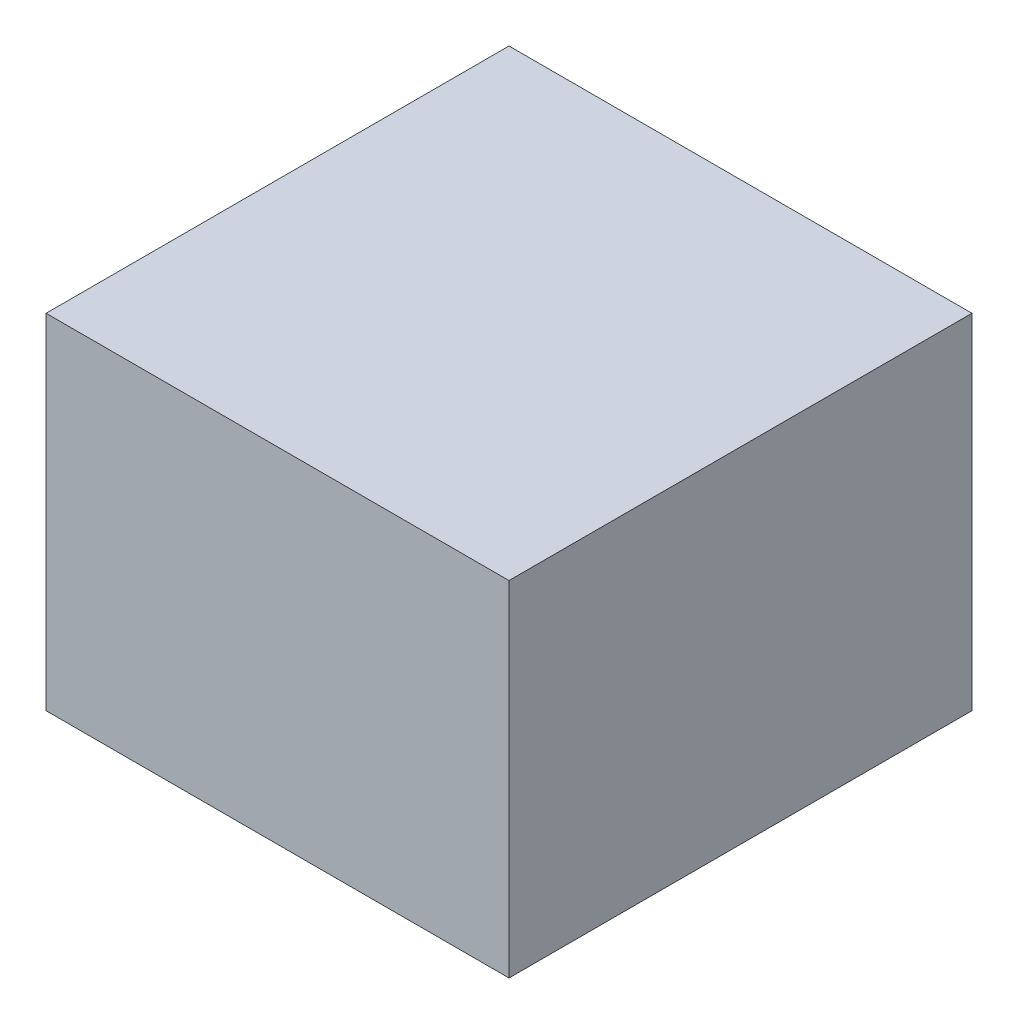
ISO-10303-21;
HEADER;
FILE_DESCRIPTION(('STEP AP214'),'2;1');
FILE_NAME('part.step','',(''),(''),'','','');
FILE_SCHEMA(('AUTOMOTIVE_DESIGN { 1 0 10303 214 1 1 1 1 }'));
ENDSEC;
DATA;
#1=APPLICATION_CONTEXT('core data for automotive mechanical design processes');
#2=APPLICATION_PROTOCOL_DEFINITION('international standard','automotive_design',2000,#1);
#3=PRODUCT_CONTEXT('',#1,'mechanical');
#4=PRODUCT('Part','Part','',(#3));
#5=PRODUCT_RELATED_PRODUCT_CATEGORY('part','',(#4));
#6=PRODUCT_DEFINITION_FORMATION('','',#4);
#7=PRODUCT_DEFINITION_CONTEXT('part definition',#1,'design');
#8=PRODUCT_DEFINITION('design','',#6,#7);
#9=PRODUCT_DEFINITION_SHAPE('','',#8);
#10=(LENGTH_UNIT() NAMED_UNIT(*) SI_UNIT(.MILLI.,.METRE.));
#11=(NAMED_UNIT(*) PLANE_ANGLE_UNIT() SI_UNIT($,.RADIAN.));
#12=(NAMED_UNIT(*) SI_UNIT($,.STERADIAN.) SOLID_ANGLE_UNIT());
#13=UNCERTAINTY_MEASURE_WITH_UNIT(LENGTH_MEASURE(1.E-05),#10,'distance_accuracy_value','');
#14=(GEOMETRIC_REPRESENTATION_CONTEXT(3) GLOBAL_UNCERTAINTY_ASSIGNED_CONTEXT((#13)) GLOBAL_UNIT_ASSIGNED_CONTEXT((#10,
#11,#12)) REPRESENTATION_CONTEXT('',''));
#15=CARTESIAN_POINT('',(0.,0.,0.));
#16=DIRECTION('',(0.,0.,1.));
#17=DIRECTION('',(1.,0.,0.));
#18=AXIS2_PLACEMENT_3D('',#15,#16,#17);
#19=CARTESIAN_POINT('',(0.,11.6,0.));
#20=DIRECTION('',(1.,0.,0.));
#21=DIRECTION('',(0.,0.,-1.));
#22=AXIS2_PLACEMENT_3D('',#19,#20,#21);
#23=PLANE('',#22);
#24=DIRECTION('',(0.,0.,1.));
#25=VECTOR('',#24,1.);
#26=CARTESIAN_POINT('',(0.,0.,0.));
#27=LINE('',#26,#25);
#28=CARTESIAN_POINT('',(0.,0.,-15.6));
#29=VERTEX_POINT('',#28);
#30=CARTESIAN_POINT('',(0.,0.,0.));
#31=VERTEX_POINT('',#30);
#32=EDGE_CURVE('E96',#29,#31,#27,.T.);
#33=ORIENTED_EDGE('',*,*,#32,.T.);
#34=DIRECTION('',(0.,-1.,0.));
#35=VECTOR('',#34,1.);
#36=CARTESIAN_POINT('',(0.,11.6,0.));
#37=LINE('',#36,#35);
#38=CARTESIAN_POINT('',(0.,11.6,0.));
#39=VERTEX_POINT('',#38);
#40=EDGE_CURVE('E11',#39,#31,#37,.T.);
#41=ORIENTED_EDGE('',*,*,#40,.F.);
#42=DIRECTION('',(0.,0.,1.));
#43=VECTOR('',#42,1.);
#44=CARTESIAN_POINT('',(0.,11.6,0.));
#45=LINE('',#44,#43);
#46=CARTESIAN_POINT('',(0.,11.6,-15.6));
#47=VERTEX_POINT('',#46);
#48=EDGE_CURVE('E84',#47,#39,#45,.T.);
#49=ORIENTED_EDGE('',*,*,#48,.F.);
#50=DIRECTION('',(0.,-1.,0.));
#51=VECTOR('',#50,1.);
#52=CARTESIAN_POINT('',(0.,11.6,-15.6));
#53=LINE('',#52,#51);
#54=EDGE_CURVE('E92',#47,#29,#53,.T.);
#55=ORIENTED_EDGE('',*,*,#54,.T.);
#56=EDGE_LOOP('',(#33,#41,#49,#55));
#57=FACE_BOUND('',#56,.T.);
#58=ADVANCED_FACE('F33',(#57),#23,.F.);
#59=CARTESIAN_POINT('',(0.,11.6,0.));
#60=DIRECTION('',(0.,0.,-1.));
#61=DIRECTION('',(-1.,0.,0.));
#62=AXIS2_PLACEMENT_3D('',#59,#60,#61);
#63=PLANE('',#62);
#64=DIRECTION('',(1.,0.,0.));
#65=VECTOR('',#64,1.);
#66=CARTESIAN_POINT('',(0.,0.,0.));
#67=LINE('',#66,#65);
#68=CARTESIAN_POINT('',(15.6,0.,0.));
#69=VERTEX_POINT('',#68);
#70=EDGE_CURVE('E88',#31,#69,#67,.T.);
#71=ORIENTED_EDGE('',*,*,#70,.T.);
#72=DIRECTION('',(0.,-1.,0.));
#73=VECTOR('',#72,1.);
#74=CARTESIAN_POINT('',(15.6,11.6,0.));
#75=LINE('',#74,#73);
#76=CARTESIAN_POINT('',(15.6,11.6,0.));
#77=VERTEX_POINT('',#76);
#78=EDGE_CURVE('E41',#77,#69,#75,.T.);
#79=ORIENTED_EDGE('',*,*,#78,.F.);
#80=DIRECTION('',(1.,0.,0.));
#81=VECTOR('',#80,1.);
#82=CARTESIAN_POINT('',(0.,11.6,0.));
#83=LINE('',#82,#81);
#84=EDGE_CURVE('E79',#39,#77,#83,.T.);
#85=ORIENTED_EDGE('',*,*,#84,.F.);
#86=ORIENTED_EDGE('',*,*,#40,.T.);
#87=EDGE_LOOP('',(#71,#79,#85,#86));
#88=FACE_BOUND('',#87,.T.);
#89=ADVANCED_FACE('F87',(#88),#63,.F.);
#90=CARTESIAN_POINT('',(15.6,11.6,0.));
#91=DIRECTION('',(-1.,0.,0.));
#92=DIRECTION('',(0.,0.,1.));
#93=AXIS2_PLACEMENT_3D('',#90,#91,#92);
#94=PLANE('',#93);
#95=DIRECTION('',(0.,0.,-1.));
#96=VECTOR('',#95,1.);
#97=CARTESIAN_POINT('',(15.6,0.,0.));
#98=LINE('',#97,#96);
#99=CARTESIAN_POINT('',(15.6,0.,-15.6));
#100=VERTEX_POINT('',#99);
#101=EDGE_CURVE('E66',#69,#100,#98,.T.);
#102=ORIENTED_EDGE('',*,*,#101,.T.);
#103=DIRECTION('',(0.,-1.,0.));
#104=VECTOR('',#103,1.);
#105=CARTESIAN_POINT('',(15.6,11.6,-15.6));
#106=LINE('',#105,#104);
#107=CARTESIAN_POINT('',(15.6,11.6,-15.6));
#108=VERTEX_POINT('',#107);
#109=EDGE_CURVE('E89',#108,#100,#106,.T.);
#110=ORIENTED_EDGE('',*,*,#109,.F.);
#111=DIRECTION('',(0.,0.,-1.));
#112=VECTOR('',#111,1.);
#113=CARTESIAN_POINT('',(15.6,11.6,0.));
#114=LINE('',#113,#112);
#115=EDGE_CURVE('E82',#77,#108,#114,.T.);
#116=ORIENTED_EDGE('',*,*,#115,.F.);
#117=ORIENTED_EDGE('',*,*,#78,.T.);
#118=EDGE_LOOP('',(#102,#110,#116,#117));
#119=FACE_BOUND('',#118,.T.);
#120=ADVANCED_FACE('F90',(#119),#94,.F.);
#121=CARTESIAN_POINT('',(0.,11.6,-15.6));
#122=DIRECTION('',(0.,0.,1.));
#123=DIRECTION('',(1.,0.,0.));
#124=AXIS2_PLACEMENT_3D('',#121,#122,#123);
#125=PLANE('',#124);
#126=DIRECTION('',(-1.,0.,0.));
#127=VECTOR('',#126,1.);
#128=CARTESIAN_POINT('',(0.,0.,-15.6));
#129=LINE('',#128,#127);
#130=EDGE_CURVE('E72',#100,#29,#129,.T.);
#131=ORIENTED_EDGE('',*,*,#130,.T.);
#132=ORIENTED_EDGE('',*,*,#54,.F.);
#133=DIRECTION('',(-1.,0.,0.));
#134=VECTOR('',#133,1.);
#135=CARTESIAN_POINT('',(0.,11.6,-15.6));
#136=LINE('',#135,#134);
#137=EDGE_CURVE('E49',#108,#47,#136,.T.);
#138=ORIENTED_EDGE('',*,*,#137,.F.);
#139=ORIENTED_EDGE('',*,*,#109,.T.);
#140=EDGE_LOOP('',(#131,#132,#138,#139));
#141=FACE_BOUND('',#140,.T.);
#142=ADVANCED_FACE('F103',(#141),#125,.F.);
#143=CARTESIAN_POINT('',(0.,11.6,0.));
#144=DIRECTION('',(0.,-1.,0.));
#145=DIRECTION('',(0.,0.,-1.));
#146=AXIS2_PLACEMENT_3D('',#143,#144,#145);
#147=PLANE('',#146);
#148=ORIENTED_EDGE('',*,*,#48,.T.);
#149=ORIENTED_EDGE('',*,*,#84,.T.);
#150=ORIENTED_EDGE('',*,*,#115,.T.);
#151=ORIENTED_EDGE('',*,*,#137,.T.);
#152=EDGE_LOOP('',(#148,#149,#150,#151));
#153=FACE_BOUND('',#152,.T.);
#154=ADVANCED_FACE('F80',(#153),#147,.F.);
#155=CARTESIAN_POINT('',(0.,0.,0.));
#156=DIRECTION('',(0.,-1.,0.));
#157=DIRECTION('',(0.,0.,-1.));
#158=AXIS2_PLACEMENT_3D('',#155,#156,#157);
#159=PLANE('',#158);
#160=ORIENTED_EDGE('',*,*,#32,.F.);
#161=ORIENTED_EDGE('',*,*,#130,.F.);
#162=ORIENTED_EDGE('',*,*,#101,.F.);
#163=ORIENTED_EDGE('',*,*,#70,.F.);
#164=EDGE_LOOP('',(#160,#161,#162,#163));
#165=FACE_BOUND('',#164,.T.);
#166=ADVANCED_FACE('F106',(#165),#159,.T.);
#167=CLOSED_SHELL('',(#58,#89,#120,#142,#154,#166));
#168=MANIFOLD_SOLID_BREP('B2',#167);
#169=ADVANCED_BREP_SHAPE_REPRESENTATION('',(#18,#168),#14);
#170=SHAPE_DEFINITION_REPRESENTATION(#9,#169);
ENDSEC;
END-ISO-10303-21;
